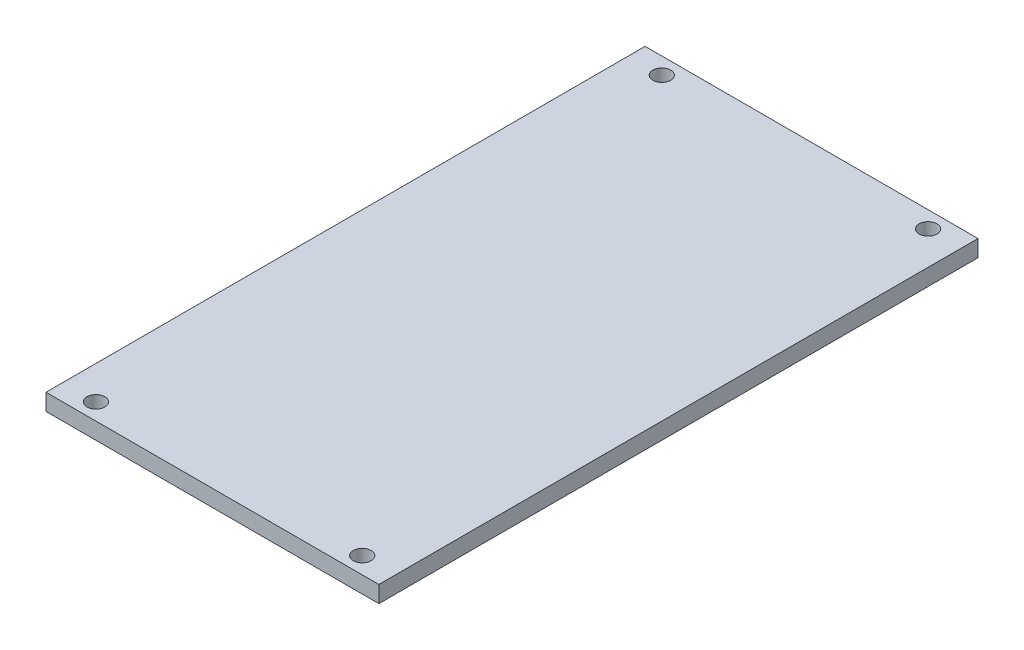
ISO-10303-21;
HEADER;
FILE_DESCRIPTION(('STEP AP214'),'2;1');
FILE_NAME('part.step','',(''),(''),'','','');
FILE_SCHEMA(('AUTOMOTIVE_DESIGN { 1 0 10303 214 1 1 1 1 }'));
ENDSEC;
DATA;
#1=APPLICATION_CONTEXT('core data for automotive mechanical design processes');
#2=APPLICATION_PROTOCOL_DEFINITION('international standard','automotive_design',2000,#1);
#3=PRODUCT_CONTEXT('',#1,'mechanical');
#4=PRODUCT('Part','Part','',(#3));
#5=PRODUCT_RELATED_PRODUCT_CATEGORY('part','',(#4));
#6=PRODUCT_DEFINITION_FORMATION('','',#4);
#7=PRODUCT_DEFINITION_CONTEXT('part definition',#1,'design');
#8=PRODUCT_DEFINITION('design','',#6,#7);
#9=PRODUCT_DEFINITION_SHAPE('','',#8);
#10=(LENGTH_UNIT() NAMED_UNIT(*) SI_UNIT(.MILLI.,.METRE.));
#11=(NAMED_UNIT(*) PLANE_ANGLE_UNIT() SI_UNIT($,.RADIAN.));
#12=(NAMED_UNIT(*) SI_UNIT($,.STERADIAN.) SOLID_ANGLE_UNIT());
#13=UNCERTAINTY_MEASURE_WITH_UNIT(LENGTH_MEASURE(1.E-05),#10,'distance_accuracy_value','');
#14=(GEOMETRIC_REPRESENTATION_CONTEXT(3) GLOBAL_UNCERTAINTY_ASSIGNED_CONTEXT((#13)) GLOBAL_UNIT_ASSIGNED_CONTEXT((#10,
#11,#12)) REPRESENTATION_CONTEXT('',''));
#15=CARTESIAN_POINT('',(0.,0.,0.));
#16=DIRECTION('',(0.,0.,1.));
#17=DIRECTION('',(1.,0.,0.));
#18=AXIS2_PLACEMENT_3D('',#15,#16,#17);
#19=CARTESIAN_POINT('',(31.75,3.175,-57.15));
#20=DIRECTION('',(-1.,0.,0.));
#21=DIRECTION('',(0.,0.,1.));
#22=AXIS2_PLACEMENT_3D('',#19,#20,#21);
#23=PLANE('',#22);
#24=DIRECTION('',(0.,0.,-1.));
#25=VECTOR('',#24,1.);
#26=CARTESIAN_POINT('',(31.75,0.,-57.15));
#27=LINE('',#26,#25);
#28=CARTESIAN_POINT('',(31.75,0.,57.15));
#29=VERTEX_POINT('',#28);
#30=CARTESIAN_POINT('',(31.75,0.,-57.15));
#31=VERTEX_POINT('',#30);
#32=EDGE_CURVE('E107',#29,#31,#27,.T.);
#33=ORIENTED_EDGE('',*,*,#32,.T.);
#34=DIRECTION('',(0.,-1.,0.));
#35=VECTOR('',#34,1.);
#36=CARTESIAN_POINT('',(31.75,3.175,-57.15));
#37=LINE('',#36,#35);
#38=CARTESIAN_POINT('',(31.75,3.175,-57.15));
#39=VERTEX_POINT('',#38);
#40=EDGE_CURVE('E11',#39,#31,#37,.T.);
#41=ORIENTED_EDGE('',*,*,#40,.F.);
#42=DIRECTION('',(0.,0.,-1.));
#43=VECTOR('',#42,1.);
#44=CARTESIAN_POINT('',(31.75,3.175,-57.15));
#45=LINE('',#44,#43);
#46=CARTESIAN_POINT('',(31.75,3.175,57.15));
#47=VERTEX_POINT('',#46);
#48=EDGE_CURVE('E91',#47,#39,#45,.T.);
#49=ORIENTED_EDGE('',*,*,#48,.F.);
#50=DIRECTION('',(0.,-1.,0.));
#51=VECTOR('',#50,1.);
#52=CARTESIAN_POINT('',(31.75,3.175,57.15));
#53=LINE('',#52,#51);
#54=EDGE_CURVE('E103',#47,#29,#53,.T.);
#55=ORIENTED_EDGE('',*,*,#54,.T.);
#56=EDGE_LOOP('',(#33,#41,#49,#55));
#57=FACE_BOUND('',#56,.T.);
#58=ADVANCED_FACE('F39',(#57),#23,.F.);
#59=CARTESIAN_POINT('',(-31.75,3.175,-57.15));
#60=DIRECTION('',(0.,0.,1.));
#61=DIRECTION('',(1.,0.,0.));
#62=AXIS2_PLACEMENT_3D('',#59,#60,#61);
#63=PLANE('',#62);
#64=DIRECTION('',(-1.,0.,0.));
#65=VECTOR('',#64,1.);
#66=CARTESIAN_POINT('',(-31.75,0.,-57.15));
#67=LINE('',#66,#65);
#68=CARTESIAN_POINT('',(-31.75,0.,-57.15));
#69=VERTEX_POINT('',#68);
#70=EDGE_CURVE('E96',#31,#69,#67,.T.);
#71=ORIENTED_EDGE('',*,*,#70,.T.);
#72=DIRECTION('',(0.,-1.,0.));
#73=VECTOR('',#72,1.);
#74=CARTESIAN_POINT('',(-31.75,3.175,-57.15));
#75=LINE('',#74,#73);
#76=CARTESIAN_POINT('',(-31.75,3.175,-57.15));
#77=VERTEX_POINT('',#76);
#78=EDGE_CURVE('E48',#77,#69,#75,.T.);
#79=ORIENTED_EDGE('',*,*,#78,.F.);
#80=DIRECTION('',(-1.,0.,0.));
#81=VECTOR('',#80,1.);
#82=CARTESIAN_POINT('',(-31.75,3.175,-57.15));
#83=LINE('',#82,#81);
#84=EDGE_CURVE('E86',#39,#77,#83,.T.);
#85=ORIENTED_EDGE('',*,*,#84,.F.);
#86=ORIENTED_EDGE('',*,*,#40,.T.);
#87=EDGE_LOOP('',(#71,#79,#85,#86));
#88=FACE_BOUND('',#87,.T.);
#89=ADVANCED_FACE('F95',(#88),#63,.F.);
#90=CARTESIAN_POINT('',(-31.75,3.175,-57.15));
#91=DIRECTION('',(1.,0.,0.));
#92=DIRECTION('',(0.,0.,-1.));
#93=AXIS2_PLACEMENT_3D('',#90,#91,#92);
#94=PLANE('',#93);
#95=DIRECTION('',(0.,0.,1.));
#96=VECTOR('',#95,1.);
#97=CARTESIAN_POINT('',(-31.75,0.,-57.15));
#98=LINE('',#97,#96);
#99=CARTESIAN_POINT('',(-31.75,0.,57.15));
#100=VERTEX_POINT('',#99);
#101=EDGE_CURVE('E73',#69,#100,#98,.T.);
#102=ORIENTED_EDGE('',*,*,#101,.T.);
#103=DIRECTION('',(0.,-1.,0.));
#104=VECTOR('',#103,1.);
#105=CARTESIAN_POINT('',(-31.75,3.175,57.15));
#106=LINE('',#105,#104);
#107=CARTESIAN_POINT('',(-31.75,3.175,57.15));
#108=VERTEX_POINT('',#107);
#109=EDGE_CURVE('E98',#108,#100,#106,.T.);
#110=ORIENTED_EDGE('',*,*,#109,.F.);
#111=DIRECTION('',(0.,0.,1.));
#112=VECTOR('',#111,1.);
#113=CARTESIAN_POINT('',(-31.75,3.175,-57.15));
#114=LINE('',#113,#112);
#115=EDGE_CURVE('E89',#77,#108,#114,.T.);
#116=ORIENTED_EDGE('',*,*,#115,.F.);
#117=ORIENTED_EDGE('',*,*,#78,.T.);
#118=EDGE_LOOP('',(#102,#110,#116,#117));
#119=FACE_BOUND('',#118,.T.);
#120=ADVANCED_FACE('F99',(#119),#94,.F.);
#121=CARTESIAN_POINT('',(-31.75,3.175,57.15));
#122=DIRECTION('',(0.,0.,-1.));
#123=DIRECTION('',(-1.,0.,0.));
#124=AXIS2_PLACEMENT_3D('',#121,#122,#123);
#125=PLANE('',#124);
#126=DIRECTION('',(1.,0.,0.));
#127=VECTOR('',#126,1.);
#128=CARTESIAN_POINT('',(-31.75,0.,57.15));
#129=LINE('',#128,#127);
#130=EDGE_CURVE('E79',#100,#29,#129,.T.);
#131=ORIENTED_EDGE('',*,*,#130,.T.);
#132=ORIENTED_EDGE('',*,*,#54,.F.);
#133=DIRECTION('',(1.,0.,0.));
#134=VECTOR('',#133,1.);
#135=CARTESIAN_POINT('',(-31.75,3.175,57.15));
#136=LINE('',#135,#134);
#137=EDGE_CURVE('E56',#108,#47,#136,.T.);
#138=ORIENTED_EDGE('',*,*,#137,.F.);
#139=ORIENTED_EDGE('',*,*,#109,.T.);
#140=EDGE_LOOP('',(#131,#132,#138,#139));
#141=FACE_BOUND('',#140,.T.);
#142=ADVANCED_FACE('F121',(#141),#125,.F.);
#143=CARTESIAN_POINT('',(0.,3.175,0.));
#144=DIRECTION('',(0.,1.,0.));
#145=DIRECTION('',(0.,0.,1.));
#146=AXIS2_PLACEMENT_3D('',#143,#144,#145);
#147=PLANE('',#146);
#148=CARTESIAN_POINT('',(-25.4,3.175,53.975));
#149=DIRECTION('',(0.,-1.,0.));
#150=DIRECTION('',(0.,0.,-1.));
#151=AXIS2_PLACEMENT_3D('',#148,#149,#150);
#152=CIRCLE('',#151,1.7);
#153=CARTESIAN_POINT('',(-25.4,3.175,52.275));
#154=VERTEX_POINT('',#153);
#155=EDGE_CURVE('E152',#154,#154,#152,.T.);
#156=ORIENTED_EDGE('',*,*,#155,.T.);
#157=EDGE_LOOP('',(#156));
#158=FACE_BOUND('',#157,.T.);
#159=CARTESIAN_POINT('',(25.4,3.175,53.975));
#160=DIRECTION('',(0.,-1.,0.));
#161=DIRECTION('',(0.,0.,-1.));
#162=AXIS2_PLACEMENT_3D('',#159,#160,#161);
#163=CIRCLE('',#162,1.7);
#164=CARTESIAN_POINT('',(25.4,3.175,52.275));
#165=VERTEX_POINT('',#164);
#166=EDGE_CURVE('E144',#165,#165,#163,.T.);
#167=ORIENTED_EDGE('',*,*,#166,.T.);
#168=EDGE_LOOP('',(#167));
#169=FACE_BOUND('',#168,.T.);
#170=CARTESIAN_POINT('',(-25.4,3.175,-53.975));
#171=DIRECTION('',(0.,1.,0.));
#172=DIRECTION('',(0.,0.,1.));
#173=AXIS2_PLACEMENT_3D('',#170,#171,#172);
#174=CIRCLE('',#173,1.7);
#175=CARTESIAN_POINT('',(-25.4,3.175,-52.275));
#176=VERTEX_POINT('',#175);
#177=EDGE_CURVE('E137',#176,#176,#174,.T.);
#178=ORIENTED_EDGE('',*,*,#177,.F.);
#179=EDGE_LOOP('',(#178));
#180=FACE_BOUND('',#179,.T.);
#181=CARTESIAN_POINT('',(25.4,3.175,-53.975));
#182=DIRECTION('',(0.,1.,0.));
#183=DIRECTION('',(0.,0.,1.));
#184=AXIS2_PLACEMENT_3D('',#181,#182,#183);
#185=CIRCLE('',#184,1.7);
#186=CARTESIAN_POINT('',(25.4,3.175,-52.275));
#187=VERTEX_POINT('',#186);
#188=EDGE_CURVE('E128',#187,#187,#185,.T.);
#189=ORIENTED_EDGE('',*,*,#188,.F.);
#190=EDGE_LOOP('',(#189));
#191=FACE_BOUND('',#190,.T.);
#192=ORIENTED_EDGE('',*,*,#48,.T.);
#193=ORIENTED_EDGE('',*,*,#84,.T.);
#194=ORIENTED_EDGE('',*,*,#115,.T.);
#195=ORIENTED_EDGE('',*,*,#137,.T.);
#196=EDGE_LOOP('',(#192,#193,#194,#195));
#197=FACE_BOUND('',#196,.T.);
#198=ADVANCED_FACE('F87',(#158,#169,#180,#191,#197),#147,.T.);
#199=CARTESIAN_POINT('',(0.,0.,0.));
#200=DIRECTION('',(0.,1.,0.));
#201=DIRECTION('',(0.,0.,1.));
#202=AXIS2_PLACEMENT_3D('',#199,#200,#201);
#203=PLANE('',#202);
#204=CARTESIAN_POINT('',(-25.4,0.,53.975));
#205=DIRECTION('',(0.,-1.,0.));
#206=DIRECTION('',(0.,0.,-1.));
#207=AXIS2_PLACEMENT_3D('',#204,#205,#206);
#208=CIRCLE('',#207,1.7);
#209=CARTESIAN_POINT('',(-25.4,0.,52.275));
#210=VERTEX_POINT('',#209);
#211=EDGE_CURVE('E133',#210,#210,#208,.T.);
#212=ORIENTED_EDGE('',*,*,#211,.F.);
#213=EDGE_LOOP('',(#212));
#214=FACE_BOUND('',#213,.T.);
#215=CARTESIAN_POINT('',(25.4,0.,53.975));
#216=DIRECTION('',(0.,-1.,0.));
#217=DIRECTION('',(0.,0.,-1.));
#218=AXIS2_PLACEMENT_3D('',#215,#216,#217);
#219=CIRCLE('',#218,1.7);
#220=CARTESIAN_POINT('',(25.4,0.,52.275));
#221=VERTEX_POINT('',#220);
#222=EDGE_CURVE('E148',#221,#221,#219,.T.);
#223=ORIENTED_EDGE('',*,*,#222,.F.);
#224=EDGE_LOOP('',(#223));
#225=FACE_BOUND('',#224,.T.);
#226=CARTESIAN_POINT('',(-25.4,0.,-53.975));
#227=DIRECTION('',(0.,1.,0.));
#228=DIRECTION('',(0.,0.,1.));
#229=AXIS2_PLACEMENT_3D('',#226,#227,#228);
#230=CIRCLE('',#229,1.7);
#231=CARTESIAN_POINT('',(-25.4,0.,-52.275));
#232=VERTEX_POINT('',#231);
#233=EDGE_CURVE('E111',#232,#232,#230,.T.);
#234=ORIENTED_EDGE('',*,*,#233,.T.);
#235=EDGE_LOOP('',(#234));
#236=FACE_BOUND('',#235,.T.);
#237=CARTESIAN_POINT('',(25.4,0.,-53.975));
#238=DIRECTION('',(0.,1.,0.));
#239=DIRECTION('',(0.,0.,1.));
#240=AXIS2_PLACEMENT_3D('',#237,#238,#239);
#241=CIRCLE('',#240,1.7);
#242=CARTESIAN_POINT('',(25.4,0.,-52.275));
#243=VERTEX_POINT('',#242);
#244=EDGE_CURVE('E132',#243,#243,#241,.T.);
#245=ORIENTED_EDGE('',*,*,#244,.T.);
#246=EDGE_LOOP('',(#245));
#247=FACE_BOUND('',#246,.T.);
#248=ORIENTED_EDGE('',*,*,#32,.F.);
#249=ORIENTED_EDGE('',*,*,#130,.F.);
#250=ORIENTED_EDGE('',*,*,#101,.F.);
#251=ORIENTED_EDGE('',*,*,#70,.F.);
#252=EDGE_LOOP('',(#248,#249,#250,#251));
#253=FACE_BOUND('',#252,.T.);
#254=ADVANCED_FACE('F124',(#214,#225,#236,#247,#253),#203,.F.);
#255=CARTESIAN_POINT('',(25.4,0.,-53.975));
#256=DIRECTION('',(0.,1.,0.));
#257=DIRECTION('',(0.,0.,1.));
#258=AXIS2_PLACEMENT_3D('',#255,#256,#257);
#259=CYLINDRICAL_SURFACE('',#258,1.7);
#260=ORIENTED_EDGE('',*,*,#244,.F.);
#261=EDGE_LOOP('',(#260));
#262=FACE_BOUND('',#261,.T.);
#263=ORIENTED_EDGE('',*,*,#188,.T.);
#264=EDGE_LOOP('',(#263));
#265=FACE_BOUND('',#264,.T.);
#266=ADVANCED_FACE('F165',(#262,#265),#259,.F.);
#267=CARTESIAN_POINT('',(-25.4,0.,-53.975));
#268=DIRECTION('',(0.,1.,0.));
#269=DIRECTION('',(0.,0.,1.));
#270=AXIS2_PLACEMENT_3D('',#267,#268,#269);
#271=CYLINDRICAL_SURFACE('',#270,1.7);
#272=ORIENTED_EDGE('',*,*,#233,.F.);
#273=EDGE_LOOP('',(#272));
#274=FACE_BOUND('',#273,.T.);
#275=ORIENTED_EDGE('',*,*,#177,.T.);
#276=EDGE_LOOP('',(#275));
#277=FACE_BOUND('',#276,.T.);
#278=ADVANCED_FACE('F175',(#274,#277),#271,.F.);
#279=CARTESIAN_POINT('',(25.4,0.,53.975));
#280=DIRECTION('',(0.,1.,0.));
#281=DIRECTION('',(0.,0.,1.));
#282=AXIS2_PLACEMENT_3D('',#279,#280,#281);
#283=CYLINDRICAL_SURFACE('',#282,1.7);
#284=ORIENTED_EDGE('',*,*,#222,.T.);
#285=EDGE_LOOP('',(#284));
#286=FACE_BOUND('',#285,.T.);
#287=ORIENTED_EDGE('',*,*,#166,.F.);
#288=EDGE_LOOP('',(#287));
#289=FACE_BOUND('',#288,.T.);
#290=ADVANCED_FACE('F217',(#286,#289),#283,.F.);
#291=CARTESIAN_POINT('',(-25.4,0.,53.975));
#292=DIRECTION('',(0.,1.,0.));
#293=DIRECTION('',(0.,0.,1.));
#294=AXIS2_PLACEMENT_3D('',#291,#292,#293);
#295=CYLINDRICAL_SURFACE('',#294,1.7);
#296=ORIENTED_EDGE('',*,*,#211,.T.);
#297=EDGE_LOOP('',(#296));
#298=FACE_BOUND('',#297,.T.);
#299=ORIENTED_EDGE('',*,*,#155,.F.);
#300=EDGE_LOOP('',(#299));
#301=FACE_BOUND('',#300,.T.);
#302=ADVANCED_FACE('F160',(#298,#301),#295,.F.);
#303=CLOSED_SHELL('',(#58,#89,#120,#142,#198,#254,#266,#278,#290,#302));
#304=MANIFOLD_SOLID_BREP('B2',#303);
#305=ADVANCED_BREP_SHAPE_REPRESENTATION('',(#18,#304),#14);
#306=SHAPE_DEFINITION_REPRESENTATION(#9,#305);
ENDSEC;
END-ISO-10303-21;
